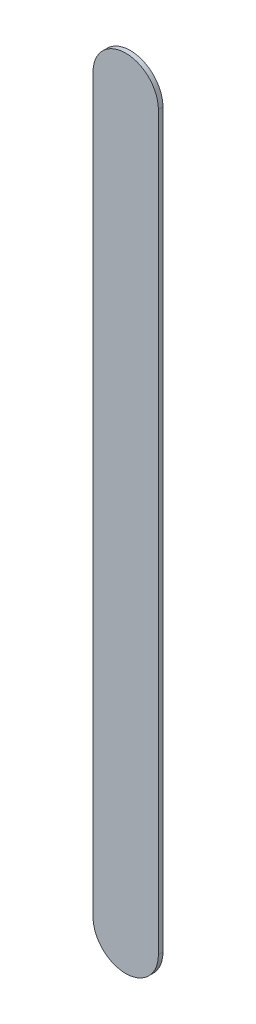
ISO-10303-21;
HEADER;
FILE_DESCRIPTION(('STEP AP214'),'2;1');
FILE_NAME('part.step','',(''),(''),'','','');
FILE_SCHEMA(('AUTOMOTIVE_DESIGN { 1 0 10303 214 1 1 1 1 }'));
ENDSEC;
DATA;
#1=APPLICATION_CONTEXT('core data for automotive mechanical design processes');
#2=APPLICATION_PROTOCOL_DEFINITION('international standard','automotive_design',2000,#1);
#3=PRODUCT_CONTEXT('',#1,'mechanical');
#4=PRODUCT('Part','Part','',(#3));
#5=PRODUCT_RELATED_PRODUCT_CATEGORY('part','',(#4));
#6=PRODUCT_DEFINITION_FORMATION('','',#4);
#7=PRODUCT_DEFINITION_CONTEXT('part definition',#1,'design');
#8=PRODUCT_DEFINITION('design','',#6,#7);
#9=PRODUCT_DEFINITION_SHAPE('','',#8);
#10=(LENGTH_UNIT() NAMED_UNIT(*) SI_UNIT(.MILLI.,.METRE.));
#11=(NAMED_UNIT(*) PLANE_ANGLE_UNIT() SI_UNIT($,.RADIAN.));
#12=(NAMED_UNIT(*) SI_UNIT($,.STERADIAN.) SOLID_ANGLE_UNIT());
#13=UNCERTAINTY_MEASURE_WITH_UNIT(LENGTH_MEASURE(1.E-05),#10,'distance_accuracy_value','');
#14=(GEOMETRIC_REPRESENTATION_CONTEXT(3) GLOBAL_UNCERTAINTY_ASSIGNED_CONTEXT((#13)) GLOBAL_UNIT_ASSIGNED_CONTEXT((#10,
#11,#12)) REPRESENTATION_CONTEXT('',''));
#15=CARTESIAN_POINT('',(0.,0.,0.));
#16=DIRECTION('',(0.,0.,1.));
#17=DIRECTION('',(1.,0.,0.));
#18=AXIS2_PLACEMENT_3D('',#15,#16,#17);
#19=CARTESIAN_POINT('',(98.4,-115.3,1.635));
#20=DIRECTION('',(0.,0.,1.));
#21=DIRECTION('',(1.,0.,0.));
#22=AXIS2_PLACEMENT_3D('',#19,#20,#21);
#23=PLANE('',#22);
#24=DIRECTION('',(0.,1.,0.));
#25=VECTOR('',#24,1.);
#26=CARTESIAN_POINT('',(98.4,-115.3,1.635));
#27=LINE('',#26,#25);
#28=CARTESIAN_POINT('',(98.4,-115.3,1.635));
#29=VERTEX_POINT('',#28);
#30=CARTESIAN_POINT('',(98.4,-109.7,1.635));
#31=VERTEX_POINT('',#30);
#32=EDGE_CURVE('E69',#29,#31,#27,.T.);
#33=ORIENTED_EDGE('',*,*,#32,.T.);
#34=CARTESIAN_POINT('',(98.15,-109.7,1.635));
#35=DIRECTION('',(0.,0.,1.));
#36=DIRECTION('',(1.,0.,0.));
#37=AXIS2_PLACEMENT_3D('',#34,#35,#36);
#38=CIRCLE('',#37,0.25);
#39=CARTESIAN_POINT('',(97.9,-109.7,1.635));
#40=VERTEX_POINT('',#39);
#41=EDGE_CURVE('E67',#31,#40,#38,.T.);
#42=ORIENTED_EDGE('',*,*,#41,.T.);
#43=DIRECTION('',(0.,-1.,0.));
#44=VECTOR('',#43,1.);
#45=CARTESIAN_POINT('',(97.9,-109.7,1.635));
#46=LINE('',#45,#44);
#47=CARTESIAN_POINT('',(97.9,-115.3,1.635));
#48=VERTEX_POINT('',#47);
#49=EDGE_CURVE('E54',#40,#48,#46,.T.);
#50=ORIENTED_EDGE('',*,*,#49,.T.);
#51=CARTESIAN_POINT('',(98.15,-115.3,1.635));
#52=DIRECTION('',(0.,0.,1.));
#53=DIRECTION('',(-1.,0.,0.));
#54=AXIS2_PLACEMENT_3D('',#51,#52,#53);
#55=CIRCLE('',#54,0.25);
#56=EDGE_CURVE('E11',#48,#29,#55,.T.);
#57=ORIENTED_EDGE('',*,*,#56,.T.);
#58=EDGE_LOOP('',(#33,#42,#50,#57));
#59=FACE_BOUND('',#58,.T.);
#60=ADVANCED_FACE('F17',(#59),#23,.T.);
#61=CARTESIAN_POINT('',(98.4,-115.3,1.6));
#62=DIRECTION('',(0.,0.,1.));
#63=DIRECTION('',(1.,0.,0.));
#64=AXIS2_PLACEMENT_3D('',#61,#62,#63);
#65=PLANE('',#64);
#66=CARTESIAN_POINT('',(98.15,-115.3,1.6));
#67=DIRECTION('',(0.,0.,1.));
#68=DIRECTION('',(-1.,0.,0.));
#69=AXIS2_PLACEMENT_3D('',#66,#67,#68);
#70=CIRCLE('',#69,0.25);
#71=CARTESIAN_POINT('',(97.9,-115.3,1.6));
#72=VERTEX_POINT('',#71);
#73=CARTESIAN_POINT('',(98.4,-115.3,1.6));
#74=VERTEX_POINT('',#73);
#75=EDGE_CURVE('E26',#72,#74,#70,.T.);
#76=ORIENTED_EDGE('',*,*,#75,.F.);
#77=DIRECTION('',(0.,-1.,0.));
#78=VECTOR('',#77,1.);
#79=CARTESIAN_POINT('',(97.9,-109.7,1.6));
#80=LINE('',#79,#78);
#81=CARTESIAN_POINT('',(97.9,-109.7,1.6));
#82=VERTEX_POINT('',#81);
#83=EDGE_CURVE('E74',#82,#72,#80,.T.);
#84=ORIENTED_EDGE('',*,*,#83,.F.);
#85=CARTESIAN_POINT('',(98.15,-109.7,1.6));
#86=DIRECTION('',(0.,0.,1.));
#87=DIRECTION('',(1.,0.,0.));
#88=AXIS2_PLACEMENT_3D('',#85,#86,#87);
#89=CIRCLE('',#88,0.25);
#90=CARTESIAN_POINT('',(98.4,-109.7,1.6));
#91=VERTEX_POINT('',#90);
#92=EDGE_CURVE('E78',#91,#82,#89,.T.);
#93=ORIENTED_EDGE('',*,*,#92,.F.);
#94=DIRECTION('',(0.,1.,0.));
#95=VECTOR('',#94,1.);
#96=CARTESIAN_POINT('',(98.4,-115.3,1.6));
#97=LINE('',#96,#95);
#98=EDGE_CURVE('E106',#74,#91,#97,.T.);
#99=ORIENTED_EDGE('',*,*,#98,.F.);
#100=EDGE_LOOP('',(#76,#84,#93,#99));
#101=FACE_BOUND('',#100,.T.);
#102=ADVANCED_FACE('F109',(#101),#65,.F.);
#103=CARTESIAN_POINT('',(98.15,-115.3,1.6));
#104=DIRECTION('',(0.,0.,-1.));
#105=DIRECTION('',(-1.,0.,0.));
#106=AXIS2_PLACEMENT_3D('',#103,#104,#105);
#107=CYLINDRICAL_SURFACE('',#106,0.25);
#108=ORIENTED_EDGE('',*,*,#75,.T.);
#109=DIRECTION('',(0.,0.,1.));
#110=VECTOR('',#109,1.);
#111=CARTESIAN_POINT('',(98.4,-115.3,1.6));
#112=LINE('',#111,#110);
#113=EDGE_CURVE('E85',#74,#29,#112,.T.);
#114=ORIENTED_EDGE('',*,*,#113,.T.);
#115=ORIENTED_EDGE('',*,*,#56,.F.);
#116=DIRECTION('',(0.,0.,1.));
#117=VECTOR('',#116,1.);
#118=CARTESIAN_POINT('',(97.9,-115.3,1.6));
#119=LINE('',#118,#117);
#120=EDGE_CURVE('E61',#72,#48,#119,.T.);
#121=ORIENTED_EDGE('',*,*,#120,.F.);
#122=EDGE_LOOP('',(#108,#114,#115,#121));
#123=FACE_BOUND('',#122,.T.);
#124=ADVANCED_FACE('F98',(#123),#107,.T.);
#125=CARTESIAN_POINT('',(97.9,-109.7,1.6));
#126=DIRECTION('',(1.,0.,0.));
#127=DIRECTION('',(0.,1.,0.));
#128=AXIS2_PLACEMENT_3D('',#125,#126,#127);
#129=PLANE('',#128);
#130=ORIENTED_EDGE('',*,*,#83,.T.);
#131=ORIENTED_EDGE('',*,*,#120,.T.);
#132=ORIENTED_EDGE('',*,*,#49,.F.);
#133=DIRECTION('',(0.,0.,1.));
#134=VECTOR('',#133,1.);
#135=CARTESIAN_POINT('',(97.9,-109.7,1.6));
#136=LINE('',#135,#134);
#137=EDGE_CURVE('E59',#82,#40,#136,.T.);
#138=ORIENTED_EDGE('',*,*,#137,.F.);
#139=EDGE_LOOP('',(#130,#131,#132,#138));
#140=FACE_BOUND('',#139,.T.);
#141=ADVANCED_FACE('F57',(#140),#129,.F.);
#142=CARTESIAN_POINT('',(98.15,-109.7,1.6));
#143=DIRECTION('',(0.,0.,-1.));
#144=DIRECTION('',(1.,0.,0.));
#145=AXIS2_PLACEMENT_3D('',#142,#143,#144);
#146=CYLINDRICAL_SURFACE('',#145,0.25);
#147=ORIENTED_EDGE('',*,*,#92,.T.);
#148=ORIENTED_EDGE('',*,*,#137,.T.);
#149=ORIENTED_EDGE('',*,*,#41,.F.);
#150=DIRECTION('',(0.,0.,1.));
#151=VECTOR('',#150,1.);
#152=CARTESIAN_POINT('',(98.4,-109.7,1.6));
#153=LINE('',#152,#151);
#154=EDGE_CURVE('E111',#91,#31,#153,.T.);
#155=ORIENTED_EDGE('',*,*,#154,.F.);
#156=EDGE_LOOP('',(#147,#148,#149,#155));
#157=FACE_BOUND('',#156,.T.);
#158=ADVANCED_FACE('F76',(#157),#146,.T.);
#159=CARTESIAN_POINT('',(98.4,-115.3,1.6));
#160=DIRECTION('',(-1.,0.,0.));
#161=DIRECTION('',(0.,0.,1.));
#162=AXIS2_PLACEMENT_3D('',#159,#160,#161);
#163=PLANE('',#162);
#164=ORIENTED_EDGE('',*,*,#98,.T.);
#165=ORIENTED_EDGE('',*,*,#154,.T.);
#166=ORIENTED_EDGE('',*,*,#32,.F.);
#167=ORIENTED_EDGE('',*,*,#113,.F.);
#168=EDGE_LOOP('',(#164,#165,#166,#167));
#169=FACE_BOUND('',#168,.T.);
#170=ADVANCED_FACE('F105',(#169),#163,.F.);
#171=CLOSED_SHELL('',(#60,#102,#124,#141,#158,#170));
#172=MANIFOLD_SOLID_BREP('B1',#171);
#173=ADVANCED_BREP_SHAPE_REPRESENTATION('',(#18,#172),#14);
#174=SHAPE_DEFINITION_REPRESENTATION(#9,#173);
ENDSEC;
END-ISO-10303-21;
